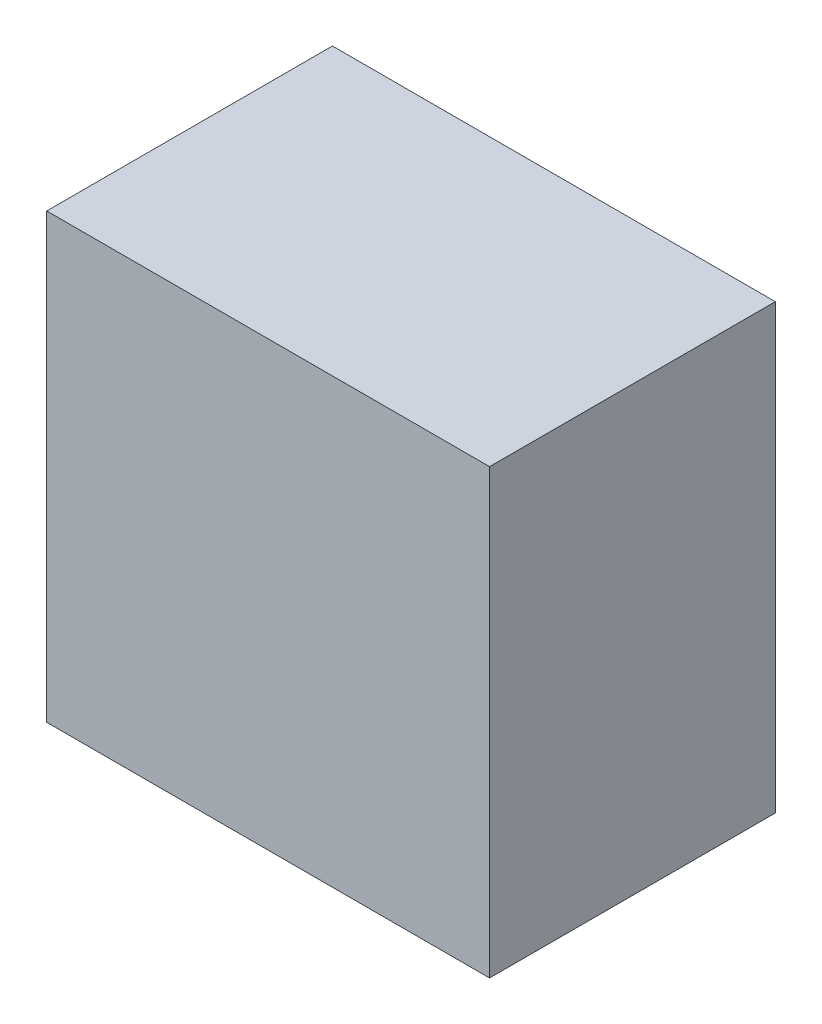
ISO-10303-21;
HEADER;
FILE_DESCRIPTION(('STEP AP214'),'2;1');
FILE_NAME('part.step','',(''),(''),'','','');
FILE_SCHEMA(('AUTOMOTIVE_DESIGN { 1 0 10303 214 1 1 1 1 }'));
ENDSEC;
DATA;
#1=APPLICATION_CONTEXT('core data for automotive mechanical design processes');
#2=APPLICATION_PROTOCOL_DEFINITION('international standard','automotive_design',2000,#1);
#3=PRODUCT_CONTEXT('',#1,'mechanical');
#4=PRODUCT('Part','Part','',(#3));
#5=PRODUCT_RELATED_PRODUCT_CATEGORY('part','',(#4));
#6=PRODUCT_DEFINITION_FORMATION('','',#4);
#7=PRODUCT_DEFINITION_CONTEXT('part definition',#1,'design');
#8=PRODUCT_DEFINITION('design','',#6,#7);
#9=PRODUCT_DEFINITION_SHAPE('','',#8);
#10=(LENGTH_UNIT() NAMED_UNIT(*) SI_UNIT(.MILLI.,.METRE.));
#11=(NAMED_UNIT(*) PLANE_ANGLE_UNIT() SI_UNIT($,.RADIAN.));
#12=(NAMED_UNIT(*) SI_UNIT($,.STERADIAN.) SOLID_ANGLE_UNIT());
#13=UNCERTAINTY_MEASURE_WITH_UNIT(LENGTH_MEASURE(1.E-05),#10,'distance_accuracy_value','');
#14=(GEOMETRIC_REPRESENTATION_CONTEXT(3) GLOBAL_UNCERTAINTY_ASSIGNED_CONTEXT((#13)) GLOBAL_UNIT_ASSIGNED_CONTEXT((#10,
#11,#12)) REPRESENTATION_CONTEXT('',''));
#15=CARTESIAN_POINT('',(0.,0.,0.));
#16=DIRECTION('',(0.,0.,1.));
#17=DIRECTION('',(1.,0.,0.));
#18=AXIS2_PLACEMENT_3D('',#15,#16,#17);
#19=CARTESIAN_POINT('',(-6.2000003,6.2000003,7.99999924));
#20=DIRECTION('',(0.,0.,-1.));
#21=DIRECTION('',(-1.,0.,0.));
#22=AXIS2_PLACEMENT_3D('',#19,#20,#21);
#23=PLANE('',#22);
#24=DIRECTION('',(1.,0.,0.));
#25=VECTOR('',#24,1.);
#26=CARTESIAN_POINT('',(-6.2000003,-6.2000003,7.99999924));
#27=LINE('',#26,#25);
#28=CARTESIAN_POINT('',(-6.2000003,-6.2000003,7.99999924));
#29=VERTEX_POINT('',#28);
#30=CARTESIAN_POINT('',(6.2000003,-6.2000003,7.99999924));
#31=VERTEX_POINT('',#30);
#32=EDGE_CURVE('E55',#29,#31,#27,.T.);
#33=ORIENTED_EDGE('',*,*,#32,.T.);
#34=DIRECTION('',(0.,1.,0.));
#35=VECTOR('',#34,1.);
#36=CARTESIAN_POINT('',(6.2000003,-6.2000003,7.99999924));
#37=LINE('',#36,#35);
#38=CARTESIAN_POINT('',(6.2000003,6.2000003,7.99999924));
#39=VERTEX_POINT('',#38);
#40=EDGE_CURVE('E57',#31,#39,#37,.T.);
#41=ORIENTED_EDGE('',*,*,#40,.T.);
#42=DIRECTION('',(1.,0.,0.));
#43=VECTOR('',#42,1.);
#44=CARTESIAN_POINT('',(6.2000003,6.2000003,7.99999924));
#45=LINE('',#44,#43);
#46=CARTESIAN_POINT('',(-6.2000003,6.2000003,7.99999924));
#47=VERTEX_POINT('',#46);
#48=EDGE_CURVE('E20',#39,#47,#45,.F.);
#49=ORIENTED_EDGE('',*,*,#48,.T.);
#50=DIRECTION('',(0.,1.,0.));
#51=VECTOR('',#50,1.);
#52=CARTESIAN_POINT('',(-6.2000003,6.2000003,7.99999924));
#53=LINE('',#52,#51);
#54=EDGE_CURVE('E80',#47,#29,#53,.F.);
#55=ORIENTED_EDGE('',*,*,#54,.T.);
#56=EDGE_LOOP('',(#33,#41,#49,#55));
#57=FACE_BOUND('',#56,.T.);
#58=ADVANCED_FACE('F17',(#57),#23,.F.);
#59=CARTESIAN_POINT('',(6.2000003,6.2000003,0.));
#60=DIRECTION('',(0.,-1.,0.));
#61=DIRECTION('',(0.,0.,-1.));
#62=AXIS2_PLACEMENT_3D('',#59,#60,#61);
#63=PLANE('',#62);
#64=DIRECTION('',(0.,0.,-1.));
#65=VECTOR('',#64,1.);
#66=CARTESIAN_POINT('',(-6.2000003,6.2000003,0.));
#67=LINE('',#66,#65);
#68=CARTESIAN_POINT('',(-6.2000003,6.2000003,0.));
#69=VERTEX_POINT('',#68);
#70=EDGE_CURVE('E68',#69,#47,#67,.F.);
#71=ORIENTED_EDGE('',*,*,#70,.T.);
#72=ORIENTED_EDGE('',*,*,#48,.F.);
#73=DIRECTION('',(0.,0.,1.));
#74=VECTOR('',#73,1.);
#75=CARTESIAN_POINT('',(6.2000003,6.2000003,0.));
#76=LINE('',#75,#74);
#77=CARTESIAN_POINT('',(6.2000003,6.2000003,0.));
#78=VERTEX_POINT('',#77);
#79=EDGE_CURVE('E63',#39,#78,#76,.F.);
#80=ORIENTED_EDGE('',*,*,#79,.T.);
#81=DIRECTION('',(-1.,0.,0.));
#82=VECTOR('',#81,1.);
#83=CARTESIAN_POINT('',(-6.2000003,6.2000003,0.));
#84=LINE('',#83,#82);
#85=EDGE_CURVE('E83',#69,#78,#84,.F.);
#86=ORIENTED_EDGE('',*,*,#85,.F.);
#87=EDGE_LOOP('',(#71,#72,#80,#86));
#88=FACE_BOUND('',#87,.T.);
#89=ADVANCED_FACE('F65',(#88),#63,.F.);
#90=CARTESIAN_POINT('',(6.2000003,-6.2000003,0.));
#91=DIRECTION('',(-1.,0.,0.));
#92=DIRECTION('',(0.,0.,1.));
#93=AXIS2_PLACEMENT_3D('',#90,#91,#92);
#94=PLANE('',#93);
#95=ORIENTED_EDGE('',*,*,#79,.F.);
#96=ORIENTED_EDGE('',*,*,#40,.F.);
#97=DIRECTION('',(0.,0.,1.));
#98=VECTOR('',#97,1.);
#99=CARTESIAN_POINT('',(6.2000003,-6.2000003,0.));
#100=LINE('',#99,#98);
#101=CARTESIAN_POINT('',(6.2000003,-6.2000003,0.));
#102=VERTEX_POINT('',#101);
#103=EDGE_CURVE('E75',#31,#102,#100,.F.);
#104=ORIENTED_EDGE('',*,*,#103,.T.);
#105=DIRECTION('',(0.,1.,0.));
#106=VECTOR('',#105,1.);
#107=CARTESIAN_POINT('',(6.2000003,6.2000003,0.));
#108=LINE('',#107,#106);
#109=EDGE_CURVE('E72',#78,#102,#108,.F.);
#110=ORIENTED_EDGE('',*,*,#109,.F.);
#111=EDGE_LOOP('',(#95,#96,#104,#110));
#112=FACE_BOUND('',#111,.T.);
#113=ADVANCED_FACE('F70',(#112),#94,.F.);
#114=CARTESIAN_POINT('',(-6.2000003,-6.2000003,0.));
#115=DIRECTION('',(0.,1.,0.));
#116=DIRECTION('',(0.,0.,1.));
#117=AXIS2_PLACEMENT_3D('',#114,#115,#116);
#118=PLANE('',#117);
#119=ORIENTED_EDGE('',*,*,#103,.F.);
#120=ORIENTED_EDGE('',*,*,#32,.F.);
#121=DIRECTION('',(0.,0.,-1.));
#122=VECTOR('',#121,1.);
#123=CARTESIAN_POINT('',(-6.2000003,-6.2000003,0.));
#124=LINE('',#123,#122);
#125=CARTESIAN_POINT('',(-6.2000003,-6.2000003,0.));
#126=VERTEX_POINT('',#125);
#127=EDGE_CURVE('E35',#29,#126,#124,.T.);
#128=ORIENTED_EDGE('',*,*,#127,.T.);
#129=DIRECTION('',(-1.,0.,0.));
#130=VECTOR('',#129,1.);
#131=CARTESIAN_POINT('',(-6.2000003,-6.2000003,0.));
#132=LINE('',#131,#130);
#133=EDGE_CURVE('E26',#102,#126,#132,.T.);
#134=ORIENTED_EDGE('',*,*,#133,.F.);
#135=EDGE_LOOP('',(#119,#120,#128,#134));
#136=FACE_BOUND('',#135,.T.);
#137=ADVANCED_FACE('F89',(#136),#118,.F.);
#138=CARTESIAN_POINT('',(-6.2000003,6.2000003,0.));
#139=DIRECTION('',(1.,0.,0.));
#140=DIRECTION('',(0.,0.,-1.));
#141=AXIS2_PLACEMENT_3D('',#138,#139,#140);
#142=PLANE('',#141);
#143=ORIENTED_EDGE('',*,*,#127,.F.);
#144=ORIENTED_EDGE('',*,*,#54,.F.);
#145=ORIENTED_EDGE('',*,*,#70,.F.);
#146=DIRECTION('',(0.,1.,0.));
#147=VECTOR('',#146,1.);
#148=CARTESIAN_POINT('',(-6.2000003,6.2000003,0.));
#149=LINE('',#148,#147);
#150=EDGE_CURVE('E11',#126,#69,#149,.T.);
#151=ORIENTED_EDGE('',*,*,#150,.F.);
#152=EDGE_LOOP('',(#143,#144,#145,#151));
#153=FACE_BOUND('',#152,.T.);
#154=ADVANCED_FACE('F91',(#153),#142,.F.);
#155=CARTESIAN_POINT('',(-6.2000003,6.2000003,0.));
#156=DIRECTION('',(0.,0.,-1.));
#157=DIRECTION('',(-1.,0.,0.));
#158=AXIS2_PLACEMENT_3D('',#155,#156,#157);
#159=PLANE('',#158);
#160=ORIENTED_EDGE('',*,*,#133,.T.);
#161=ORIENTED_EDGE('',*,*,#150,.T.);
#162=ORIENTED_EDGE('',*,*,#85,.T.);
#163=ORIENTED_EDGE('',*,*,#109,.T.);
#164=EDGE_LOOP('',(#160,#161,#162,#163));
#165=FACE_BOUND('',#164,.T.);
#166=ADVANCED_FACE('F88',(#165),#159,.T.);
#167=CLOSED_SHELL('',(#58,#89,#113,#137,#154,#166));
#168=MANIFOLD_SOLID_BREP('B1',#167);
#169=ADVANCED_BREP_SHAPE_REPRESENTATION('',(#18,#168),#14);
#170=SHAPE_DEFINITION_REPRESENTATION(#9,#169);
ENDSEC;
END-ISO-10303-21;
